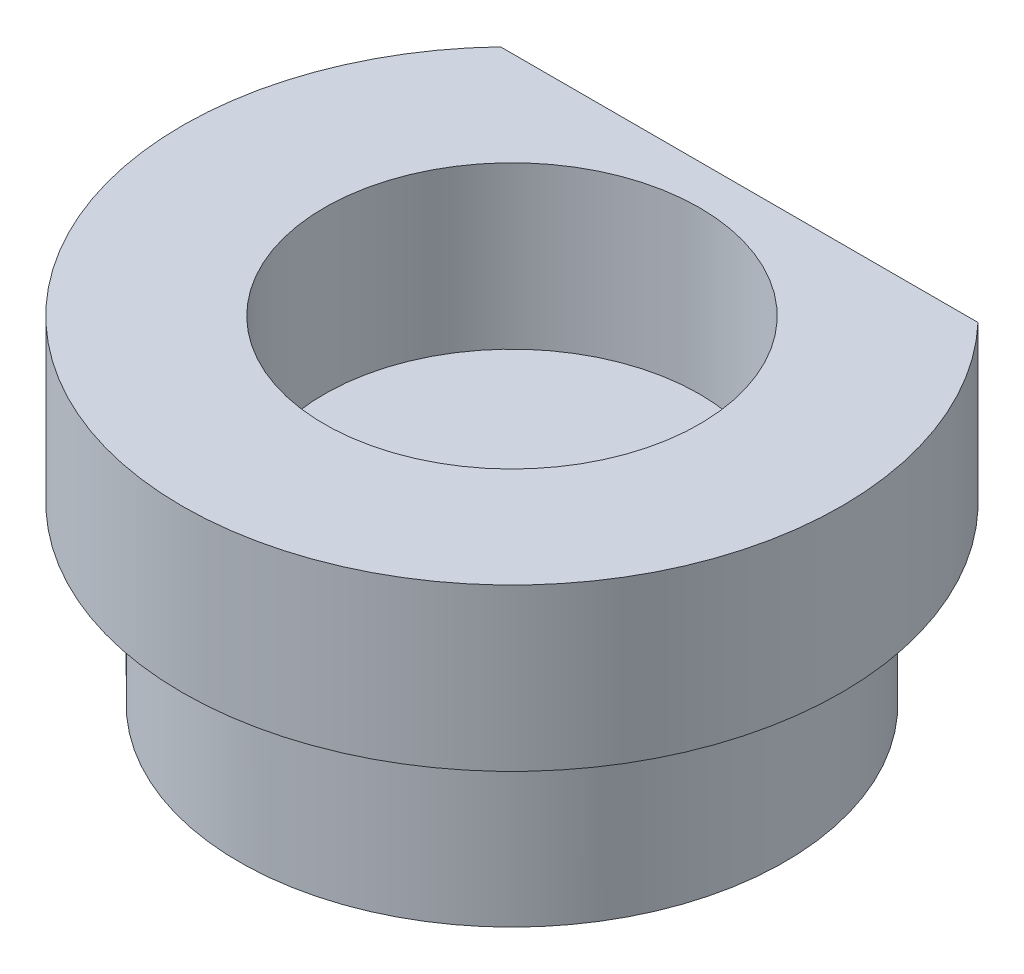
ISO-10303-21;
HEADER;
FILE_DESCRIPTION(('STEP AP214'),'2;1');
FILE_NAME('part.step','',(''),(''),'','','');
FILE_SCHEMA(('AUTOMOTIVE_DESIGN { 1 0 10303 214 1 1 1 1 }'));
ENDSEC;
DATA;
#1=APPLICATION_CONTEXT('core data for automotive mechanical design processes');
#2=APPLICATION_PROTOCOL_DEFINITION('international standard','automotive_design',2000,#1);
#3=PRODUCT_CONTEXT('',#1,'mechanical');
#4=PRODUCT('Part','Part','',(#3));
#5=PRODUCT_RELATED_PRODUCT_CATEGORY('part','',(#4));
#6=PRODUCT_DEFINITION_FORMATION('','',#4);
#7=PRODUCT_DEFINITION_CONTEXT('part definition',#1,'design');
#8=PRODUCT_DEFINITION('design','',#6,#7);
#9=PRODUCT_DEFINITION_SHAPE('','',#8);
#10=(LENGTH_UNIT() NAMED_UNIT(*) SI_UNIT(.MILLI.,.METRE.));
#11=(NAMED_UNIT(*) PLANE_ANGLE_UNIT() SI_UNIT($,.RADIAN.));
#12=(NAMED_UNIT(*) SI_UNIT($,.STERADIAN.) SOLID_ANGLE_UNIT());
#13=UNCERTAINTY_MEASURE_WITH_UNIT(LENGTH_MEASURE(1.E-05),#10,'distance_accuracy_value','');
#14=(GEOMETRIC_REPRESENTATION_CONTEXT(3) GLOBAL_UNCERTAINTY_ASSIGNED_CONTEXT((#13)) GLOBAL_UNIT_ASSIGNED_CONTEXT((#10,
#11,#12)) REPRESENTATION_CONTEXT('',''));
#15=CARTESIAN_POINT('',(0.,0.,0.));
#16=DIRECTION('',(0.,0.,1.));
#17=DIRECTION('',(1.,0.,0.));
#18=AXIS2_PLACEMENT_3D('',#15,#16,#17);
#19=CARTESIAN_POINT('',(0.,-18.034,0.));
#20=DIRECTION('',(0.,1.,0.));
#21=DIRECTION('',(0.,0.,1.));
#22=AXIS2_PLACEMENT_3D('',#19,#20,#21);
#23=CYLINDRICAL_SURFACE('',#22,36.83);
#24=CARTESIAN_POINT('',(0.,0.,0.));
#25=DIRECTION('',(0.,-1.,0.));
#26=DIRECTION('',(0.,0.,-1.));
#27=AXIS2_PLACEMENT_3D('',#24,#25,#26);
#28=CIRCLE('',#27,36.83);
#29=CARTESIAN_POINT('',(26.67,0.,-25.4));
#30=VERTEX_POINT('',#29);
#31=CARTESIAN_POINT('',(-26.67,0.,-25.4));
#32=VERTEX_POINT('',#31);
#33=EDGE_CURVE('E74',#30,#32,#28,.T.);
#34=ORIENTED_EDGE('',*,*,#33,.T.);
#35=DIRECTION('',(0.,1.,0.));
#36=VECTOR('',#35,1.);
#37=CARTESIAN_POINT('',(-26.67,-18.034,-25.4));
#38=LINE('',#37,#36);
#39=CARTESIAN_POINT('',(-26.67,-18.034,-25.4));
#40=VERTEX_POINT('',#39);
#41=EDGE_CURVE('E20',#40,#32,#38,.T.);
#42=ORIENTED_EDGE('',*,*,#41,.F.);
#43=CARTESIAN_POINT('',(0.,-18.034,0.));
#44=DIRECTION('',(0.,-1.,0.));
#45=DIRECTION('',(0.,0.,-1.));
#46=AXIS2_PLACEMENT_3D('',#43,#44,#45);
#47=CIRCLE('',#46,36.83);
#48=CARTESIAN_POINT('',(26.67,-18.034,-25.4));
#49=VERTEX_POINT('',#48);
#50=EDGE_CURVE('E73',#49,#40,#47,.T.);
#51=ORIENTED_EDGE('',*,*,#50,.F.);
#52=DIRECTION('',(0.,1.,0.));
#53=VECTOR('',#52,1.);
#54=CARTESIAN_POINT('',(26.67,-18.034,-25.4));
#55=LINE('',#54,#53);
#56=EDGE_CURVE('E66',#49,#30,#55,.T.);
#57=ORIENTED_EDGE('',*,*,#56,.T.);
#58=EDGE_LOOP('',(#34,#42,#51,#57));
#59=FACE_BOUND('',#58,.T.);
#60=ADVANCED_FACE('F16',(#59),#23,.T.);
#61=CARTESIAN_POINT('',(0.,-18.034,0.));
#62=DIRECTION('',(0.,1.,0.));
#63=DIRECTION('',(0.,0.,1.));
#64=AXIS2_PLACEMENT_3D('',#61,#62,#63);
#65=CYLINDRICAL_SURFACE('',#64,20.955);
#66=CARTESIAN_POINT('',(0.,-18.034,0.));
#67=DIRECTION('',(0.,-1.,0.));
#68=DIRECTION('',(0.,0.,-1.));
#69=AXIS2_PLACEMENT_3D('',#66,#67,#68);
#70=CIRCLE('',#69,20.955);
#71=CARTESIAN_POINT('',(0.,-18.034,-20.955));
#72=VERTEX_POINT('',#71);
#73=EDGE_CURVE('E87',#72,#72,#70,.T.);
#74=ORIENTED_EDGE('',*,*,#73,.T.);
#75=EDGE_LOOP('',(#74));
#76=FACE_BOUND('',#75,.T.);
#77=CARTESIAN_POINT('',(0.,0.,0.));
#78=DIRECTION('',(0.,-1.,0.));
#79=DIRECTION('',(0.,0.,-1.));
#80=AXIS2_PLACEMENT_3D('',#77,#78,#79);
#81=CIRCLE('',#80,20.955);
#82=CARTESIAN_POINT('',(0.,0.,-20.955));
#83=VERTEX_POINT('',#82);
#84=EDGE_CURVE('E81',#83,#83,#81,.T.);
#85=ORIENTED_EDGE('',*,*,#84,.F.);
#86=EDGE_LOOP('',(#85));
#87=FACE_BOUND('',#86,.T.);
#88=ADVANCED_FACE('F18',(#76,#87),#65,.F.);
#89=CARTESIAN_POINT('',(0.,-18.034,-25.4));
#90=DIRECTION('',(0.,0.,1.));
#91=DIRECTION('',(1.,0.,0.));
#92=AXIS2_PLACEMENT_3D('',#89,#90,#91);
#93=PLANE('',#92);
#94=DIRECTION('',(1.,0.,0.));
#95=VECTOR('',#94,1.);
#96=CARTESIAN_POINT('',(0.,0.,-25.4));
#97=LINE('',#96,#95);
#98=EDGE_CURVE('E63',#32,#30,#97,.T.);
#99=ORIENTED_EDGE('',*,*,#98,.T.);
#100=ORIENTED_EDGE('',*,*,#56,.F.);
#101=DIRECTION('',(1.,0.,0.));
#102=VECTOR('',#101,1.);
#103=CARTESIAN_POINT('',(0.,-18.034,-25.4));
#104=LINE('',#103,#102);
#105=CARTESIAN_POINT('',(16.8484539350054,-18.034,-25.4));
#106=VERTEX_POINT('',#105);
#107=EDGE_CURVE('E47',#106,#49,#104,.T.);
#108=ORIENTED_EDGE('',*,*,#107,.F.);
#109=CARTESIAN_POINT('',(-16.8484539350054,-18.034,-25.4));
#110=VERTEX_POINT('',#109);
#111=EDGE_CURVE('E92',#110,#106,#104,.T.);
#112=ORIENTED_EDGE('',*,*,#111,.F.);
#113=EDGE_CURVE('E78',#40,#110,#104,.T.);
#114=ORIENTED_EDGE('',*,*,#113,.F.);
#115=ORIENTED_EDGE('',*,*,#41,.T.);
#116=EDGE_LOOP('',(#99,#100,#108,#112,#114,#115));
#117=FACE_BOUND('',#116,.T.);
#118=ADVANCED_FACE('F65',(#117),#93,.F.);
#119=CARTESIAN_POINT('',(0.,-18.034,0.));
#120=DIRECTION('',(0.,-1.,0.));
#121=DIRECTION('',(1.,0.,0.));
#122=AXIS2_PLACEMENT_3D('',#119,#120,#121);
#123=PLANE('',#122);
#124=CARTESIAN_POINT('',(0.,-18.034,0.));
#125=DIRECTION('',(0.,-1.,0.));
#126=DIRECTION('',(0.,0.,-1.));
#127=AXIS2_PLACEMENT_3D('',#124,#125,#126);
#128=CIRCLE('',#127,30.48);
#129=EDGE_CURVE('E38',#106,#110,#128,.T.);
#130=ORIENTED_EDGE('',*,*,#129,.F.);
#131=ORIENTED_EDGE('',*,*,#107,.T.);
#132=ORIENTED_EDGE('',*,*,#50,.T.);
#133=ORIENTED_EDGE('',*,*,#113,.T.);
#134=EDGE_LOOP('',(#130,#131,#132,#133));
#135=FACE_BOUND('',#134,.T.);
#136=ADVANCED_FACE('F123',(#135),#123,.T.);
#137=CARTESIAN_POINT('',(0.,0.,0.));
#138=DIRECTION('',(0.,-1.,0.));
#139=DIRECTION('',(1.,0.,0.));
#140=AXIS2_PLACEMENT_3D('',#137,#138,#139);
#141=PLANE('',#140);
#142=ORIENTED_EDGE('',*,*,#84,.T.);
#143=EDGE_LOOP('',(#142));
#144=FACE_BOUND('',#143,.T.);
#145=ORIENTED_EDGE('',*,*,#33,.F.);
#146=ORIENTED_EDGE('',*,*,#98,.F.);
#147=EDGE_LOOP('',(#145,#146));
#148=FACE_BOUND('',#147,.T.);
#149=ADVANCED_FACE('F79',(#144,#148),#141,.F.);
#150=CARTESIAN_POINT('',(0.,-37.592,3.175));
#151=DIRECTION('',(0.,-1.,0.));
#152=DIRECTION('',(1.,0.,0.));
#153=AXIS2_PLACEMENT_3D('',#150,#151,#152);
#154=PLANE('',#153);
#155=CARTESIAN_POINT('',(0.,-37.592,0.));
#156=DIRECTION('',(0.,-1.,0.));
#157=DIRECTION('',(0.,0.,-1.));
#158=AXIS2_PLACEMENT_3D('',#155,#156,#157);
#159=CIRCLE('',#158,0.9906);
#160=CARTESIAN_POINT('',(0.,-37.592,-0.9906));
#161=VERTEX_POINT('',#160);
#162=EDGE_CURVE('E10',#161,#161,#159,.T.);
#163=ORIENTED_EDGE('',*,*,#162,.F.);
#164=EDGE_LOOP('',(#163));
#165=FACE_BOUND('',#164,.T.);
#166=CARTESIAN_POINT('',(0.,-37.592,0.));
#167=DIRECTION('',(0.,-1.,0.));
#168=DIRECTION('',(0.,0.,-1.));
#169=AXIS2_PLACEMENT_3D('',#166,#167,#168);
#170=CIRCLE('',#169,30.48);
#171=CARTESIAN_POINT('',(0.,-37.592,-30.48));
#172=VERTEX_POINT('',#171);
#173=EDGE_CURVE('E97',#172,#172,#170,.T.);
#174=ORIENTED_EDGE('',*,*,#173,.T.);
#175=EDGE_LOOP('',(#174));
#176=FACE_BOUND('',#175,.T.);
#177=ADVANCED_FACE('F147',(#165,#176),#154,.T.);
#178=CARTESIAN_POINT('',(0.,-37.592,0.));
#179=DIRECTION('',(0.,1.,0.));
#180=DIRECTION('',(0.,0.,1.));
#181=AXIS2_PLACEMENT_3D('',#178,#179,#180);
#182=CYLINDRICAL_SURFACE('',#181,30.48);
#183=ORIENTED_EDGE('',*,*,#173,.F.);
#184=EDGE_LOOP('',(#183));
#185=FACE_BOUND('',#184,.T.);
#186=ORIENTED_EDGE('',*,*,#129,.T.);
#187=EDGE_CURVE('E100',#110,#106,#128,.T.);
#188=ORIENTED_EDGE('',*,*,#187,.T.);
#189=EDGE_LOOP('',(#186,#188));
#190=FACE_BOUND('',#189,.T.);
#191=ADVANCED_FACE('F116',(#185,#190),#182,.T.);
#192=CARTESIAN_POINT('',(0.,-18.034,3.175));
#193=DIRECTION('',(0.,-1.,0.));
#194=DIRECTION('',(1.,0.,0.));
#195=AXIS2_PLACEMENT_3D('',#192,#193,#194);
#196=PLANE('',#195);
#197=ORIENTED_EDGE('',*,*,#187,.F.);
#198=ORIENTED_EDGE('',*,*,#111,.T.);
#199=EDGE_LOOP('',(#197,#198));
#200=FACE_BOUND('',#199,.T.);
#201=ADVANCED_FACE('F119',(#200),#196,.F.);
#202=ORIENTED_EDGE('',*,*,#73,.F.);
#203=EDGE_LOOP('',(#202));
#204=FACE_BOUND('',#203,.T.);
#205=ADVANCED_FACE('F218',(#204),#196,.F.);
#206=CARTESIAN_POINT('',(0.,-49.022,0.));
#207=DIRECTION('',(0.,1.,0.));
#208=DIRECTION('',(0.,0.,1.));
#209=AXIS2_PLACEMENT_3D('',#206,#207,#208);
#210=CYLINDRICAL_SURFACE('',#209,0.9906);
#211=CARTESIAN_POINT('',(0.,-49.022,0.));
#212=DIRECTION('',(0.,-1.,0.));
#213=DIRECTION('',(0.,0.,-1.));
#214=AXIS2_PLACEMENT_3D('',#211,#212,#213);
#215=CIRCLE('',#214,0.9906);
#216=CARTESIAN_POINT('',(0.,-49.022,-0.9906));
#217=VERTEX_POINT('',#216);
#218=EDGE_CURVE('E104',#217,#217,#215,.T.);
#219=ORIENTED_EDGE('',*,*,#218,.F.);
#220=EDGE_LOOP('',(#219));
#221=FACE_BOUND('',#220,.T.);
#222=ORIENTED_EDGE('',*,*,#162,.T.);
#223=EDGE_LOOP('',(#222));
#224=FACE_BOUND('',#223,.T.);
#225=ADVANCED_FACE('F227',(#221,#224),#210,.T.);
#226=CARTESIAN_POINT('',(0.,-49.022,0.));
#227=DIRECTION('',(0.,-1.,0.));
#228=DIRECTION('',(1.,0.,0.));
#229=AXIS2_PLACEMENT_3D('',#226,#227,#228);
#230=PLANE('',#229);
#231=ORIENTED_EDGE('',*,*,#218,.T.);
#232=EDGE_LOOP('',(#231));
#233=FACE_BOUND('',#232,.T.);
#234=ADVANCED_FACE('F236',(#233),#230,.T.);
#235=CLOSED_SHELL('',(#60,#88,#118,#136,#149,#177,#191,#201,#205,#225,#234));
#236=MANIFOLD_SOLID_BREP('B1',#235);
#237=ADVANCED_BREP_SHAPE_REPRESENTATION('',(#18,#236),#14);
#238=SHAPE_DEFINITION_REPRESENTATION(#9,#237);
ENDSEC;
END-ISO-10303-21;
